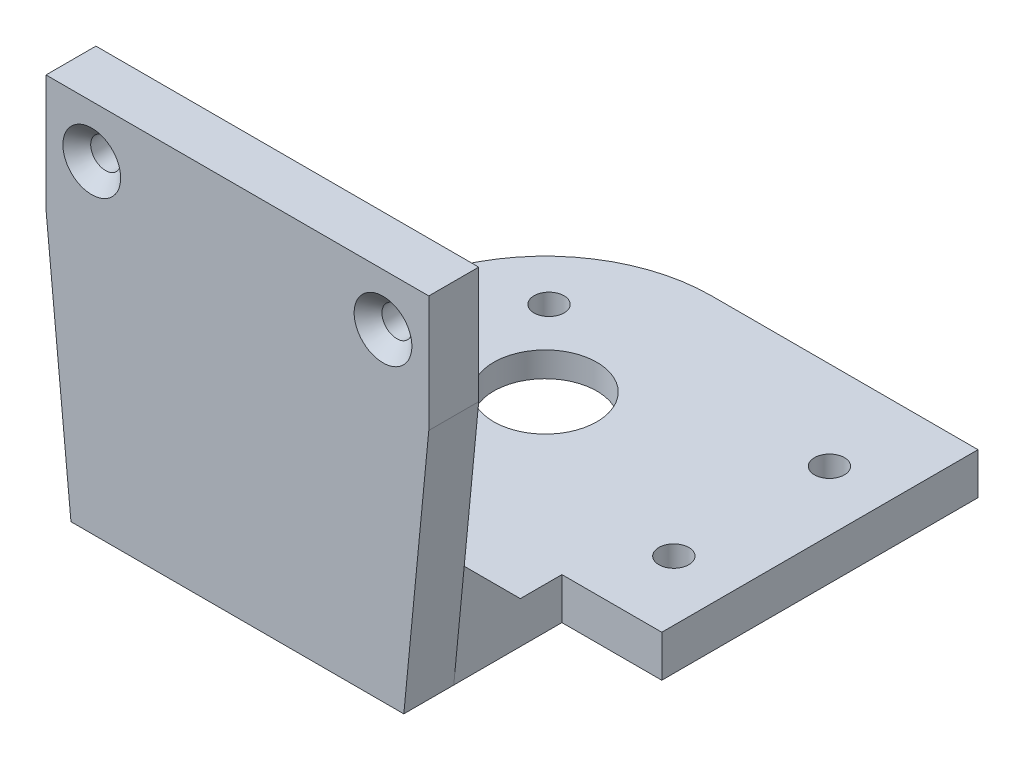
ISO-10303-21;
HEADER;
FILE_DESCRIPTION(('STEP AP214'),'2;1');
FILE_NAME('part.step','',(''),(''),'','','');
FILE_SCHEMA(('AUTOMOTIVE_DESIGN { 1 0 10303 214 1 1 1 1 }'));
ENDSEC;
DATA;
#1=APPLICATION_CONTEXT('core data for automotive mechanical design processes');
#2=APPLICATION_PROTOCOL_DEFINITION('international standard','automotive_design',2000,#1);
#3=PRODUCT_CONTEXT('',#1,'mechanical');
#4=PRODUCT('Part','Part','',(#3));
#5=PRODUCT_RELATED_PRODUCT_CATEGORY('part','',(#4));
#6=PRODUCT_DEFINITION_FORMATION('','',#4);
#7=PRODUCT_DEFINITION_CONTEXT('part definition',#1,'design');
#8=PRODUCT_DEFINITION('design','',#6,#7);
#9=PRODUCT_DEFINITION_SHAPE('','',#8);
#10=(LENGTH_UNIT() NAMED_UNIT(*) SI_UNIT(.MILLI.,.METRE.));
#11=(NAMED_UNIT(*) PLANE_ANGLE_UNIT() SI_UNIT($,.RADIAN.));
#12=(NAMED_UNIT(*) SI_UNIT($,.STERADIAN.) SOLID_ANGLE_UNIT());
#13=UNCERTAINTY_MEASURE_WITH_UNIT(LENGTH_MEASURE(1.E-05),#10,'distance_accuracy_value','');
#14=(GEOMETRIC_REPRESENTATION_CONTEXT(3) GLOBAL_UNCERTAINTY_ASSIGNED_CONTEXT((#13)) GLOBAL_UNIT_ASSIGNED_CONTEXT((#10,
#11,#12)) REPRESENTATION_CONTEXT('',''));
#15=CARTESIAN_POINT('',(0.,0.,0.));
#16=DIRECTION('',(0.,0.,1.));
#17=DIRECTION('',(1.,0.,0.));
#18=AXIS2_PLACEMENT_3D('',#15,#16,#17);
#19=CARTESIAN_POINT('',(0.,-2.,0.));
#20=DIRECTION('',(0.,1.,0.));
#21=DIRECTION('',(0.,0.,1.));
#22=AXIS2_PLACEMENT_3D('',#19,#20,#21);
#23=PLANE('',#22);
#24=CARTESIAN_POINT('',(24.7999999999998,-2.,9.35));
#25=DIRECTION('',(0.,-1.,0.));
#26=DIRECTION('',(0.,0.,-1.));
#27=AXIS2_PLACEMENT_3D('',#24,#25,#26);
#28=CIRCLE('',#27,4.25);
#29=CARTESIAN_POINT('',(24.7999999999998,-2.,5.1));
#30=VERTEX_POINT('',#29);
#31=EDGE_CURVE('E289',#30,#30,#28,.T.);
#32=ORIENTED_EDGE('',*,*,#31,.F.);
#33=EDGE_LOOP('',(#32));
#34=FACE_BOUND('',#33,.T.);
#35=CARTESIAN_POINT('',(24.7999999999998,-2.,-9.35));
#36=DIRECTION('',(0.,-1.,0.));
#37=DIRECTION('',(0.,0.,-1.));
#38=AXIS2_PLACEMENT_3D('',#35,#36,#37);
#39=CIRCLE('',#38,4.25);
#40=CARTESIAN_POINT('',(24.7999999999998,-2.,-13.6));
#41=VERTEX_POINT('',#40);
#42=EDGE_CURVE('E297',#41,#41,#39,.T.);
#43=ORIENTED_EDGE('',*,*,#42,.F.);
#44=EDGE_LOOP('',(#43));
#45=FACE_BOUND('',#44,.T.);
#46=CARTESIAN_POINT('',(0.,-2.,0.));
#47=DIRECTION('',(0.,1.,0.));
#48=DIRECTION('',(0.,0.,1.));
#49=AXIS2_PLACEMENT_3D('',#46,#47,#48);
#50=CIRCLE('',#49,20.);
#51=CARTESIAN_POINT('',(0.,-2.,-20.));
#52=VERTEX_POINT('',#51);
#53=CARTESIAN_POINT('',(-20.,-2.,0.));
#54=VERTEX_POINT('',#53);
#55=EDGE_CURVE('E247',#52,#54,#50,.T.);
#56=ORIENTED_EDGE('',*,*,#55,.F.);
#57=DIRECTION('',(1.,0.,0.));
#58=VECTOR('',#57,1.);
#59=CARTESIAN_POINT('',(0.,-2.,-20.));
#60=LINE('',#59,#58);
#61=CARTESIAN_POINT('',(32.,-2.,-20.));
#62=VERTEX_POINT('',#61);
#63=EDGE_CURVE('E159',#52,#62,#60,.T.);
#64=ORIENTED_EDGE('',*,*,#63,.T.);
#65=DIRECTION('',(0.,0.,1.));
#66=VECTOR('',#65,1.);
#67=CARTESIAN_POINT('',(32.,-2.,-20.));
#68=LINE('',#67,#66);
#69=CARTESIAN_POINT('',(32.,-2.,18.));
#70=VERTEX_POINT('',#69);
#71=EDGE_CURVE('E147',#62,#70,#68,.T.);
#72=ORIENTED_EDGE('',*,*,#71,.T.);
#73=DIRECTION('',(-1.,0.,0.));
#74=VECTOR('',#73,1.);
#75=CARTESIAN_POINT('',(32.,-2.,18.));
#76=LINE('',#75,#74);
#77=CARTESIAN_POINT('',(20.,-2.,18.));
#78=VERTEX_POINT('',#77);
#79=EDGE_CURVE('E153',#70,#78,#76,.T.);
#80=ORIENTED_EDGE('',*,*,#79,.T.);
#81=DIRECTION('',(0.,0.,1.));
#82=VECTOR('',#81,1.);
#83=CARTESIAN_POINT('',(20.,-2.,31.));
#84=LINE('',#83,#82);
#85=CARTESIAN_POINT('',(20.,-2.,31.));
#86=VERTEX_POINT('',#85);
#87=EDGE_CURVE('E232',#78,#86,#84,.T.);
#88=ORIENTED_EDGE('',*,*,#87,.T.);
#89=DIRECTION('',(0.,0.,1.));
#90=VECTOR('',#89,1.);
#91=CARTESIAN_POINT('',(20.,-2.,-0.144823004794875));
#92=LINE('',#91,#90);
#93=CARTESIAN_POINT('',(20.,-2.,37.));
#94=VERTEX_POINT('',#93);
#95=EDGE_CURVE('E190',#86,#94,#92,.T.);
#96=ORIENTED_EDGE('',*,*,#95,.T.);
#97=DIRECTION('',(1.,0.,0.));
#98=VECTOR('',#97,1.);
#99=CARTESIAN_POINT('',(-20.,-2.,37.));
#100=LINE('',#99,#98);
#101=CARTESIAN_POINT('',(-20.,-2.,37.));
#102=VERTEX_POINT('',#101);
#103=EDGE_CURVE('E225',#102,#94,#100,.T.);
#104=ORIENTED_EDGE('',*,*,#103,.F.);
#105=DIRECTION('',(0.,0.,-1.));
#106=VECTOR('',#105,1.);
#107=CARTESIAN_POINT('',(-20.,-2.,0.));
#108=LINE('',#107,#106);
#109=CARTESIAN_POINT('',(-20.,-2.,31.));
#110=VERTEX_POINT('',#109);
#111=EDGE_CURVE('E241',#102,#110,#108,.T.);
#112=ORIENTED_EDGE('',*,*,#111,.T.);
#113=EDGE_CURVE('E234',#110,#54,#108,.T.);
#114=ORIENTED_EDGE('',*,*,#113,.T.);
#115=EDGE_LOOP('',(#56,#64,#72,#80,#88,#96,#104,#112,#114));
#116=FACE_BOUND('',#115,.T.);
#117=CARTESIAN_POINT('',(0.,-2.,0.));
#118=DIRECTION('',(0.,1.,0.));
#119=DIRECTION('',(0.,0.,1.));
#120=AXIS2_PLACEMENT_3D('',#117,#118,#119);
#121=CIRCLE('',#120,18.);
#122=CARTESIAN_POINT('',(0.,-2.,18.));
#123=VERTEX_POINT('',#122);
#124=EDGE_CURVE('E244',#123,#123,#121,.T.);
#125=ORIENTED_EDGE('',*,*,#124,.T.);
#126=EDGE_LOOP('',(#125));
#127=FACE_BOUND('',#126,.T.);
#128=ADVANCED_FACE('F35',(#34,#45,#116,#127),#23,.F.);
#129=CARTESIAN_POINT('',(0.,-2.,0.));
#130=DIRECTION('',(0.,1.,0.));
#131=DIRECTION('',(0.,0.,1.));
#132=AXIS2_PLACEMENT_3D('',#129,#130,#131);
#133=CYLINDRICAL_SURFACE('',#132,20.);
#134=CARTESIAN_POINT('',(0.,3.,0.));
#135=DIRECTION('',(0.,1.,0.));
#136=DIRECTION('',(0.,0.,1.));
#137=AXIS2_PLACEMENT_3D('',#134,#135,#136);
#138=CIRCLE('',#137,20.);
#139=CARTESIAN_POINT('',(0.,3.,-20.));
#140=VERTEX_POINT('',#139);
#141=CARTESIAN_POINT('',(-20.,3.,0.));
#142=VERTEX_POINT('',#141);
#143=EDGE_CURVE('E53',#140,#142,#138,.T.);
#144=ORIENTED_EDGE('',*,*,#143,.F.);
#145=DIRECTION('',(0.,-1.,0.));
#146=VECTOR('',#145,1.);
#147=CARTESIAN_POINT('',(0.,52.6789693934969,-20.));
#148=LINE('',#147,#146);
#149=EDGE_CURVE('E58',#140,#52,#148,.T.);
#150=ORIENTED_EDGE('',*,*,#149,.T.);
#151=ORIENTED_EDGE('',*,*,#55,.T.);
#152=DIRECTION('',(0.,1.,0.));
#153=VECTOR('',#152,1.);
#154=CARTESIAN_POINT('',(-20.,-52.60632371552,0.));
#155=LINE('',#154,#153);
#156=EDGE_CURVE('E235',#54,#142,#155,.T.);
#157=ORIENTED_EDGE('',*,*,#156,.T.);
#158=EDGE_LOOP('',(#144,#150,#151,#157));
#159=FACE_BOUND('',#158,.T.);
#160=ADVANCED_FACE('F312',(#159),#133,.T.);
#161=CARTESIAN_POINT('',(0.,3.,0.));
#162=DIRECTION('',(0.,1.,0.));
#163=DIRECTION('',(0.,0.,1.));
#164=AXIS2_PLACEMENT_3D('',#161,#162,#163);
#165=PLANE('',#164);
#166=CARTESIAN_POINT('',(24.7999999999998,3.,-9.35));
#167=DIRECTION('',(0.,1.,0.));
#168=DIRECTION('',(0.,0.,1.));
#169=AXIS2_PLACEMENT_3D('',#166,#167,#168);
#170=CIRCLE('',#169,1.79999999999999);
#171=CARTESIAN_POINT('',(24.7999999999998,3.,-7.55000000000001));
#172=VERTEX_POINT('',#171);
#173=EDGE_CURVE('E281',#172,#172,#170,.T.);
#174=ORIENTED_EDGE('',*,*,#173,.F.);
#175=EDGE_LOOP('',(#174));
#176=FACE_BOUND('',#175,.T.);
#177=CARTESIAN_POINT('',(-8.90000000000018,3.,-9.35));
#178=DIRECTION('',(0.,1.,0.));
#179=DIRECTION('',(0.,0.,1.));
#180=AXIS2_PLACEMENT_3D('',#177,#178,#179);
#181=CIRCLE('',#180,1.79999999999999);
#182=CARTESIAN_POINT('',(-8.90000000000018,3.,-7.55000000000001));
#183=VERTEX_POINT('',#182);
#184=EDGE_CURVE('E279',#183,#183,#181,.T.);
#185=ORIENTED_EDGE('',*,*,#184,.F.);
#186=EDGE_LOOP('',(#185));
#187=FACE_BOUND('',#186,.T.);
#188=CARTESIAN_POINT('',(-8.90000000000019,3.,9.35));
#189=DIRECTION('',(0.,1.,0.));
#190=DIRECTION('',(0.,0.,1.));
#191=AXIS2_PLACEMENT_3D('',#188,#189,#190);
#192=CIRCLE('',#191,1.79999999999999);
#193=CARTESIAN_POINT('',(-8.90000000000019,3.,11.15));
#194=VERTEX_POINT('',#193);
#195=EDGE_CURVE('E275',#194,#194,#192,.T.);
#196=ORIENTED_EDGE('',*,*,#195,.F.);
#197=EDGE_LOOP('',(#196));
#198=FACE_BOUND('',#197,.T.);
#199=CARTESIAN_POINT('',(24.7999999999998,3.,9.35));
#200=DIRECTION('',(0.,1.,0.));
#201=DIRECTION('',(0.,0.,1.));
#202=AXIS2_PLACEMENT_3D('',#199,#200,#201);
#203=CIRCLE('',#202,1.79999999999999);
#204=CARTESIAN_POINT('',(24.7999999999998,3.,11.15));
#205=VERTEX_POINT('',#204);
#206=EDGE_CURVE('E271',#205,#205,#203,.T.);
#207=ORIENTED_EDGE('',*,*,#206,.F.);
#208=EDGE_LOOP('',(#207));
#209=FACE_BOUND('',#208,.T.);
#210=DIRECTION('',(1.,0.,0.));
#211=VECTOR('',#210,1.);
#212=CARTESIAN_POINT('',(0.,3.,-20.));
#213=LINE('',#212,#211);
#214=CARTESIAN_POINT('',(32.,3.,-20.));
#215=VERTEX_POINT('',#214);
#216=EDGE_CURVE('E135',#140,#215,#213,.T.);
#217=ORIENTED_EDGE('',*,*,#216,.F.);
#218=ORIENTED_EDGE('',*,*,#143,.T.);
#219=DIRECTION('',(0.,0.,1.));
#220=VECTOR('',#219,1.);
#221=CARTESIAN_POINT('',(-20.,3.,0.));
#222=LINE('',#221,#220);
#223=CARTESIAN_POINT('',(-20.,3.,22.9999999999999));
#224=VERTEX_POINT('',#223);
#225=EDGE_CURVE('E230',#142,#224,#222,.T.);
#226=ORIENTED_EDGE('',*,*,#225,.T.);
#227=DIRECTION('',(1.,0.,0.));
#228=VECTOR('',#227,1.);
#229=CARTESIAN_POINT('',(20.,3.,22.9999999999999));
#230=LINE('',#229,#228);
#231=CARTESIAN_POINT('',(20.,3.,22.9999999999999));
#232=VERTEX_POINT('',#231);
#233=EDGE_CURVE('E259',#224,#232,#230,.T.);
#234=ORIENTED_EDGE('',*,*,#233,.T.);
#235=DIRECTION('',(0.,0.,-1.));
#236=VECTOR('',#235,1.);
#237=CARTESIAN_POINT('',(20.,3.,31.));
#238=LINE('',#237,#236);
#239=CARTESIAN_POINT('',(20.,3.,18.));
#240=VERTEX_POINT('',#239);
#241=EDGE_CURVE('E238',#232,#240,#238,.T.);
#242=ORIENTED_EDGE('',*,*,#241,.T.);
#243=DIRECTION('',(-1.,0.,0.));
#244=VECTOR('',#243,1.);
#245=CARTESIAN_POINT('',(32.,3.,18.));
#246=LINE('',#245,#244);
#247=CARTESIAN_POINT('',(32.,3.,18.));
#248=VERTEX_POINT('',#247);
#249=EDGE_CURVE('E138',#248,#240,#246,.T.);
#250=ORIENTED_EDGE('',*,*,#249,.F.);
#251=DIRECTION('',(0.,0.,1.));
#252=VECTOR('',#251,1.);
#253=CARTESIAN_POINT('',(32.,3.,-20.));
#254=LINE('',#253,#252);
#255=EDGE_CURVE('E130',#215,#248,#254,.T.);
#256=ORIENTED_EDGE('',*,*,#255,.F.);
#257=EDGE_LOOP('',(#217,#218,#226,#234,#242,#250,#256));
#258=FACE_BOUND('',#257,.T.);
#259=CARTESIAN_POINT('',(0.,3.,0.));
#260=DIRECTION('',(0.,1.,0.));
#261=DIRECTION('',(0.,0.,1.));
#262=AXIS2_PLACEMENT_3D('',#259,#260,#261);
#263=CIRCLE('',#262,6.2);
#264=CARTESIAN_POINT('',(0.,3.,6.2));
#265=VERTEX_POINT('',#264);
#266=EDGE_CURVE('E251',#265,#265,#263,.T.);
#267=ORIENTED_EDGE('',*,*,#266,.F.);
#268=EDGE_LOOP('',(#267));
#269=FACE_BOUND('',#268,.T.);
#270=ADVANCED_FACE('F132',(#176,#187,#198,#209,#258,#269),#165,.T.);
#271=CARTESIAN_POINT('',(0.,0.,0.));
#272=DIRECTION('',(0.,1.,0.));
#273=DIRECTION('',(0.,0.,1.));
#274=AXIS2_PLACEMENT_3D('',#271,#272,#273);
#275=PLANE('',#274);
#276=CARTESIAN_POINT('',(-8.90000000000018,0.,-9.35));
#277=DIRECTION('',(0.,1.,0.));
#278=DIRECTION('',(0.,0.,1.));
#279=AXIS2_PLACEMENT_3D('',#276,#277,#278);
#280=CIRCLE('',#279,1.79999999999999);
#281=CARTESIAN_POINT('',(-8.90000000000018,0.,-7.55000000000001));
#282=VERTEX_POINT('',#281);
#283=EDGE_CURVE('E278',#282,#282,#280,.T.);
#284=ORIENTED_EDGE('',*,*,#283,.T.);
#285=EDGE_LOOP('',(#284));
#286=FACE_BOUND('',#285,.T.);
#287=CARTESIAN_POINT('',(-8.90000000000019,0.,9.35));
#288=DIRECTION('',(0.,1.,0.));
#289=DIRECTION('',(0.,0.,1.));
#290=AXIS2_PLACEMENT_3D('',#287,#288,#289);
#291=CIRCLE('',#290,1.79999999999999);
#292=CARTESIAN_POINT('',(-8.90000000000019,0.,11.15));
#293=VERTEX_POINT('',#292);
#294=EDGE_CURVE('E274',#293,#293,#291,.T.);
#295=ORIENTED_EDGE('',*,*,#294,.T.);
#296=EDGE_LOOP('',(#295));
#297=FACE_BOUND('',#296,.T.);
#298=CARTESIAN_POINT('',(0.,0.,0.));
#299=DIRECTION('',(0.,1.,0.));
#300=DIRECTION('',(0.,0.,1.));
#301=AXIS2_PLACEMENT_3D('',#298,#299,#300);
#302=CIRCLE('',#301,18.);
#303=CARTESIAN_POINT('',(0.,0.,18.));
#304=VERTEX_POINT('',#303);
#305=EDGE_CURVE('E254',#304,#304,#302,.T.);
#306=ORIENTED_EDGE('',*,*,#305,.F.);
#307=EDGE_LOOP('',(#306));
#308=FACE_BOUND('',#307,.T.);
#309=CARTESIAN_POINT('',(0.,0.,0.));
#310=DIRECTION('',(0.,1.,0.));
#311=DIRECTION('',(0.,0.,1.));
#312=AXIS2_PLACEMENT_3D('',#309,#310,#311);
#313=CIRCLE('',#312,6.2);
#314=CARTESIAN_POINT('',(0.,0.,6.2));
#315=VERTEX_POINT('',#314);
#316=EDGE_CURVE('E249',#315,#315,#313,.T.);
#317=ORIENTED_EDGE('',*,*,#316,.T.);
#318=EDGE_LOOP('',(#317));
#319=FACE_BOUND('',#318,.T.);
#320=ADVANCED_FACE('F377',(#286,#297,#308,#319),#275,.F.);
#321=CARTESIAN_POINT('',(0.,3.,0.));
#322=DIRECTION('',(0.,-1.,0.));
#323=DIRECTION('',(0.,0.,-1.));
#324=AXIS2_PLACEMENT_3D('',#321,#322,#323);
#325=CYLINDRICAL_SURFACE('',#324,6.2);
#326=ORIENTED_EDGE('',*,*,#266,.T.);
#327=EDGE_LOOP('',(#326));
#328=FACE_BOUND('',#327,.T.);
#329=ORIENTED_EDGE('',*,*,#316,.F.);
#330=EDGE_LOOP('',(#329));
#331=FACE_BOUND('',#330,.T.);
#332=ADVANCED_FACE('F374',(#328,#331),#325,.F.);
#333=CARTESIAN_POINT('',(0.,-2.,0.));
#334=DIRECTION('',(0.,1.,0.));
#335=DIRECTION('',(0.,0.,1.));
#336=AXIS2_PLACEMENT_3D('',#333,#334,#335);
#337=CYLINDRICAL_SURFACE('',#336,18.);
#338=ORIENTED_EDGE('',*,*,#124,.F.);
#339=EDGE_LOOP('',(#338));
#340=FACE_BOUND('',#339,.T.);
#341=ORIENTED_EDGE('',*,*,#305,.T.);
#342=EDGE_LOOP('',(#341));
#343=FACE_BOUND('',#342,.T.);
#344=ADVANCED_FACE('F372',(#340,#343),#337,.F.);
#345=CARTESIAN_POINT('',(20.,-52.60632371552,31.));
#346=DIRECTION('',(1.,0.,0.));
#347=DIRECTION('',(0.,0.,-1.));
#348=AXIS2_PLACEMENT_3D('',#345,#346,#347);
#349=PLANE('',#348);
#350=DIRECTION('',(0.,-1.,0.));
#351=VECTOR('',#350,1.);
#352=CARTESIAN_POINT('',(20.,52.6789693934969,18.));
#353=LINE('',#352,#351);
#354=EDGE_CURVE('E161',#240,#78,#353,.T.);
#355=ORIENTED_EDGE('',*,*,#354,.F.);
#356=ORIENTED_EDGE('',*,*,#241,.F.);
#357=DIRECTION('',(0.,-0.707106781186544,-0.707106781186552));
#358=VECTOR('',#357,1.);
#359=CARTESIAN_POINT('',(20.,3.,22.9999999999999));
#360=LINE('',#359,#358);
#361=CARTESIAN_POINT('',(20.,11.,31.));
#362=VERTEX_POINT('',#361);
#363=EDGE_CURVE('E45',#232,#362,#360,.F.);
#364=ORIENTED_EDGE('',*,*,#363,.T.);
#365=DIRECTION('',(0.,-1.,0.));
#366=VECTOR('',#365,1.);
#367=CARTESIAN_POINT('',(20.,-2.,31.));
#368=LINE('',#367,#366);
#369=EDGE_CURVE('E187',#362,#86,#368,.T.);
#370=ORIENTED_EDGE('',*,*,#369,.T.);
#371=ORIENTED_EDGE('',*,*,#87,.F.);
#372=EDGE_LOOP('',(#355,#356,#364,#370,#371));
#373=FACE_BOUND('',#372,.T.);
#374=ADVANCED_FACE('F322',(#373),#349,.T.);
#375=CARTESIAN_POINT('',(-20.,-52.60632371552,0.));
#376=DIRECTION('',(-1.,0.,0.));
#377=DIRECTION('',(0.,0.,1.));
#378=AXIS2_PLACEMENT_3D('',#375,#376,#377);
#379=PLANE('',#378);
#380=DIRECTION('',(0.,1.,0.));
#381=VECTOR('',#380,1.);
#382=CARTESIAN_POINT('',(-20.,29.,31.));
#383=LINE('',#382,#381);
#384=CARTESIAN_POINT('',(-20.,11.,31.));
#385=VERTEX_POINT('',#384);
#386=EDGE_CURVE('E198',#110,#385,#383,.T.);
#387=ORIENTED_EDGE('',*,*,#386,.T.);
#388=DIRECTION('',(0.,0.707106781186544,0.707106781186552));
#389=VECTOR('',#388,1.);
#390=CARTESIAN_POINT('',(-20.,3.,22.9999999999999));
#391=LINE('',#390,#389);
#392=EDGE_CURVE('E11',#385,#224,#391,.F.);
#393=ORIENTED_EDGE('',*,*,#392,.T.);
#394=ORIENTED_EDGE('',*,*,#225,.F.);
#395=ORIENTED_EDGE('',*,*,#156,.F.);
#396=ORIENTED_EDGE('',*,*,#113,.F.);
#397=EDGE_LOOP('',(#387,#393,#394,#395,#396));
#398=FACE_BOUND('',#397,.T.);
#399=ADVANCED_FACE('F315',(#398),#379,.T.);
#400=CARTESIAN_POINT('',(0.,0.,31.));
#401=DIRECTION('',(0.,0.,-1.));
#402=DIRECTION('',(-1.,0.,0.));
#403=AXIS2_PLACEMENT_3D('',#400,#401,#402);
#404=PLANE('',#403);
#405=CARTESIAN_POINT('',(17.4999999999999,36.7528144712617,31.));
#406=DIRECTION('',(0.,0.,-1.));
#407=DIRECTION('',(-1.,0.,0.));
#408=AXIS2_PLACEMENT_3D('',#405,#406,#407);
#409=CIRCLE('',#408,1.79999999999999);
#410=CARTESIAN_POINT('',(15.6999999999999,36.7528144712617,31.));
#411=VERTEX_POINT('',#410);
#412=EDGE_CURVE('E173',#411,#411,#409,.T.);
#413=ORIENTED_EDGE('',*,*,#412,.F.);
#414=EDGE_LOOP('',(#413));
#415=FACE_BOUND('',#414,.T.);
#416=CARTESIAN_POINT('',(-17.5000000000001,36.7528144712617,31.));
#417=DIRECTION('',(0.,0.,-1.));
#418=DIRECTION('',(-1.,0.,0.));
#419=AXIS2_PLACEMENT_3D('',#416,#417,#418);
#420=CIRCLE('',#419,1.79999999999999);
#421=CARTESIAN_POINT('',(-19.3000000000001,36.7528144712617,31.));
#422=VERTEX_POINT('',#421);
#423=EDGE_CURVE('E180',#422,#422,#420,.T.);
#424=ORIENTED_EDGE('',*,*,#423,.F.);
#425=EDGE_LOOP('',(#424));
#426=FACE_BOUND('',#425,.T.);
#427=ORIENTED_EDGE('',*,*,#369,.F.);
#428=DIRECTION('',(-1.,0.,0.));
#429=VECTOR('',#428,1.);
#430=CARTESIAN_POINT('',(-20.,11.,31.));
#431=LINE('',#430,#429);
#432=EDGE_CURVE('E262',#362,#385,#431,.T.);
#433=ORIENTED_EDGE('',*,*,#432,.T.);
#434=ORIENTED_EDGE('',*,*,#386,.F.);
#435=DIRECTION('',(0.0963241948601904,-0.9953500135553,0.));
#436=VECTOR('',#435,1.);
#437=CARTESIAN_POINT('',(-23.,29.,31.));
#438=LINE('',#437,#436);
#439=CARTESIAN_POINT('',(-23.,29.,31.));
#440=VERTEX_POINT('',#439);
#441=EDGE_CURVE('E195',#440,#110,#438,.T.);
#442=ORIENTED_EDGE('',*,*,#441,.F.);
#443=DIRECTION('',(0.,-1.,0.));
#444=VECTOR('',#443,1.);
#445=CARTESIAN_POINT('',(-23.,43.,31.));
#446=LINE('',#445,#444);
#447=CARTESIAN_POINT('',(-23.,43.,31.));
#448=VERTEX_POINT('',#447);
#449=EDGE_CURVE('E207',#448,#440,#446,.T.);
#450=ORIENTED_EDGE('',*,*,#449,.F.);
#451=DIRECTION('',(-1.,0.,0.));
#452=VECTOR('',#451,1.);
#453=CARTESIAN_POINT('',(-20.,43.,31.));
#454=LINE('',#453,#452);
#455=CARTESIAN_POINT('',(23.,43.,31.));
#456=VERTEX_POINT('',#455);
#457=EDGE_CURVE('E224',#456,#448,#454,.T.);
#458=ORIENTED_EDGE('',*,*,#457,.F.);
#459=DIRECTION('',(0.,1.,0.));
#460=VECTOR('',#459,1.);
#461=CARTESIAN_POINT('',(23.,43.,31.));
#462=LINE('',#461,#460);
#463=CARTESIAN_POINT('',(23.,29.,31.));
#464=VERTEX_POINT('',#463);
#465=EDGE_CURVE('E212',#464,#456,#462,.T.);
#466=ORIENTED_EDGE('',*,*,#465,.F.);
#467=DIRECTION('',(0.0963241948601904,0.9953500135553,0.));
#468=VECTOR('',#467,1.);
#469=CARTESIAN_POINT('',(20.,-2.,31.));
#470=LINE('',#469,#468);
#471=EDGE_CURVE('E184',#86,#464,#470,.T.);
#472=ORIENTED_EDGE('',*,*,#471,.F.);
#473=EDGE_LOOP('',(#427,#433,#434,#442,#450,#458,#466,#472));
#474=FACE_BOUND('',#473,.T.);
#475=ADVANCED_FACE('F349',(#415,#426,#474),#404,.T.);
#476=CARTESIAN_POINT('',(-20.,43.,37.));
#477=DIRECTION('',(0.,-1.,0.));
#478=DIRECTION('',(0.,0.,-1.));
#479=AXIS2_PLACEMENT_3D('',#476,#477,#478);
#480=PLANE('',#479);
#481=ORIENTED_EDGE('',*,*,#457,.T.);
#482=DIRECTION('',(0.,0.,1.));
#483=VECTOR('',#482,1.);
#484=CARTESIAN_POINT('',(-23.,43.,-17.0832611206852));
#485=LINE('',#484,#483);
#486=CARTESIAN_POINT('',(-23.,43.,37.));
#487=VERTEX_POINT('',#486);
#488=EDGE_CURVE('E211',#448,#487,#485,.T.);
#489=ORIENTED_EDGE('',*,*,#488,.T.);
#490=DIRECTION('',(-1.,0.,0.));
#491=VECTOR('',#490,1.);
#492=CARTESIAN_POINT('',(-20.,43.,37.));
#493=LINE('',#492,#491);
#494=CARTESIAN_POINT('',(23.,43.,37.));
#495=VERTEX_POINT('',#494);
#496=EDGE_CURVE('E228',#495,#487,#493,.T.);
#497=ORIENTED_EDGE('',*,*,#496,.F.);
#498=DIRECTION('',(0.,0.,1.));
#499=VECTOR('',#498,1.);
#500=CARTESIAN_POINT('',(23.,43.,-17.0832611206852));
#501=LINE('',#500,#499);
#502=EDGE_CURVE('E215',#456,#495,#501,.T.);
#503=ORIENTED_EDGE('',*,*,#502,.F.);
#504=EDGE_LOOP('',(#481,#489,#497,#503));
#505=FACE_BOUND('',#504,.T.);
#506=ADVANCED_FACE('F341',(#505),#480,.F.);
#507=CARTESIAN_POINT('',(0.,0.,37.));
#508=DIRECTION('',(0.,0.,-1.));
#509=DIRECTION('',(-1.,0.,0.));
#510=AXIS2_PLACEMENT_3D('',#507,#508,#509);
#511=PLANE('',#510);
#512=CARTESIAN_POINT('',(17.4999999999999,36.7528144712617,37.));
#513=DIRECTION('',(0.,0.,1.));
#514=DIRECTION('',(1.,0.,0.));
#515=AXIS2_PLACEMENT_3D('',#512,#513,#514);
#516=CIRCLE('',#515,3.47);
#517=CARTESIAN_POINT('',(20.9699999999999,36.7528144712617,37.));
#518=VERTEX_POINT('',#517);
#519=EDGE_CURVE('E167',#518,#518,#516,.T.);
#520=ORIENTED_EDGE('',*,*,#519,.F.);
#521=EDGE_LOOP('',(#520));
#522=FACE_BOUND('',#521,.T.);
#523=CARTESIAN_POINT('',(-17.5000000000001,36.7528144712617,37.));
#524=DIRECTION('',(0.,0.,1.));
#525=DIRECTION('',(1.,0.,0.));
#526=AXIS2_PLACEMENT_3D('',#523,#524,#525);
#527=CIRCLE('',#526,3.47);
#528=CARTESIAN_POINT('',(-14.0300000000001,36.7528144712617,37.));
#529=VERTEX_POINT('',#528);
#530=EDGE_CURVE('E174',#529,#529,#527,.T.);
#531=ORIENTED_EDGE('',*,*,#530,.F.);
#532=EDGE_LOOP('',(#531));
#533=FACE_BOUND('',#532,.T.);
#534=DIRECTION('',(0.0963241948601904,-0.9953500135553,0.));
#535=VECTOR('',#534,1.);
#536=CARTESIAN_POINT('',(-23.,29.,37.));
#537=LINE('',#536,#535);
#538=CARTESIAN_POINT('',(-23.,29.,37.));
#539=VERTEX_POINT('',#538);
#540=EDGE_CURVE('E192',#539,#102,#537,.T.);
#541=ORIENTED_EDGE('',*,*,#540,.T.);
#542=ORIENTED_EDGE('',*,*,#103,.T.);
#543=DIRECTION('',(0.0963241948601904,0.9953500135553,0.));
#544=VECTOR('',#543,1.);
#545=CARTESIAN_POINT('',(20.,-2.,37.));
#546=LINE('',#545,#544);
#547=CARTESIAN_POINT('',(23.,29.,37.));
#548=VERTEX_POINT('',#547);
#549=EDGE_CURVE('E181',#94,#548,#546,.T.);
#550=ORIENTED_EDGE('',*,*,#549,.T.);
#551=DIRECTION('',(0.,1.,0.));
#552=VECTOR('',#551,1.);
#553=CARTESIAN_POINT('',(23.,43.,37.));
#554=LINE('',#553,#552);
#555=EDGE_CURVE('E201',#548,#495,#554,.T.);
#556=ORIENTED_EDGE('',*,*,#555,.T.);
#557=ORIENTED_EDGE('',*,*,#496,.T.);
#558=DIRECTION('',(0.,-1.,0.));
#559=VECTOR('',#558,1.);
#560=CARTESIAN_POINT('',(-23.,43.,37.));
#561=LINE('',#560,#559);
#562=EDGE_CURVE('E200',#487,#539,#561,.T.);
#563=ORIENTED_EDGE('',*,*,#562,.T.);
#564=EDGE_LOOP('',(#541,#542,#550,#556,#557,#563));
#565=FACE_BOUND('',#564,.T.);
#566=ADVANCED_FACE('F332',(#522,#533,#565),#511,.F.);
#567=CARTESIAN_POINT('',(-23.,43.,-17.0832611206852));
#568=DIRECTION('',(-1.,0.,0.));
#569=DIRECTION('',(0.,-1.,0.));
#570=AXIS2_PLACEMENT_3D('',#567,#568,#569);
#571=PLANE('',#570);
#572=ORIENTED_EDGE('',*,*,#488,.F.);
#573=ORIENTED_EDGE('',*,*,#449,.T.);
#574=DIRECTION('',(0.,0.,1.));
#575=VECTOR('',#574,1.);
#576=CARTESIAN_POINT('',(-23.,29.,-17.0832611206852));
#577=LINE('',#576,#575);
#578=EDGE_CURVE('E210',#440,#539,#577,.T.);
#579=ORIENTED_EDGE('',*,*,#578,.T.);
#580=ORIENTED_EDGE('',*,*,#562,.F.);
#581=EDGE_LOOP('',(#572,#573,#579,#580));
#582=FACE_BOUND('',#581,.T.);
#583=ADVANCED_FACE('F344',(#582),#571,.T.);
#584=CARTESIAN_POINT('',(23.,43.,-17.0832611206852));
#585=DIRECTION('',(1.,0.,0.));
#586=DIRECTION('',(0.,1.,0.));
#587=AXIS2_PLACEMENT_3D('',#584,#585,#586);
#588=PLANE('',#587);
#589=DIRECTION('',(0.,0.,1.));
#590=VECTOR('',#589,1.);
#591=CARTESIAN_POINT('',(23.,29.,-17.0832611206852));
#592=LINE('',#591,#590);
#593=EDGE_CURVE('E204',#464,#548,#592,.T.);
#594=ORIENTED_EDGE('',*,*,#593,.F.);
#595=ORIENTED_EDGE('',*,*,#465,.T.);
#596=ORIENTED_EDGE('',*,*,#502,.T.);
#597=ORIENTED_EDGE('',*,*,#555,.F.);
#598=EDGE_LOOP('',(#594,#595,#596,#597));
#599=FACE_BOUND('',#598,.T.);
#600=ADVANCED_FACE('F336',(#599),#588,.T.);
#601=CARTESIAN_POINT('',(-23.,29.,-0.144823004794875));
#602=DIRECTION('',(-0.9953500135553,-0.0963241948601904,0.));
#603=DIRECTION('',(0.0963241948601904,-0.9953500135553,0.));
#604=AXIS2_PLACEMENT_3D('',#601,#602,#603);
#605=PLANE('',#604);
#606=ORIENTED_EDGE('',*,*,#578,.F.);
#607=ORIENTED_EDGE('',*,*,#441,.T.);
#608=ORIENTED_EDGE('',*,*,#111,.F.);
#609=ORIENTED_EDGE('',*,*,#540,.F.);
#610=EDGE_LOOP('',(#606,#607,#608,#609));
#611=FACE_BOUND('',#610,.T.);
#612=ADVANCED_FACE('F347',(#611),#605,.T.);
#613=CARTESIAN_POINT('',(20.,-2.,-0.144823004794875));
#614=DIRECTION('',(0.9953500135553,-0.0963241948601904,0.));
#615=DIRECTION('',(0.0963241948601904,0.9953500135553,0.));
#616=AXIS2_PLACEMENT_3D('',#613,#614,#615);
#617=PLANE('',#616);
#618=ORIENTED_EDGE('',*,*,#95,.F.);
#619=ORIENTED_EDGE('',*,*,#471,.T.);
#620=ORIENTED_EDGE('',*,*,#593,.T.);
#621=ORIENTED_EDGE('',*,*,#549,.F.);
#622=EDGE_LOOP('',(#618,#619,#620,#621));
#623=FACE_BOUND('',#622,.T.);
#624=ADVANCED_FACE('F333',(#623),#617,.T.);
#625=CARTESIAN_POINT('',(0.,3.,22.9999999999999));
#626=DIRECTION('',(0.,0.707106781186551,-0.707106781186543));
#627=DIRECTION('',(-1.,0.,0.));
#628=AXIS2_PLACEMENT_3D('',#625,#626,#627);
#629=PLANE('',#628);
#630=ORIENTED_EDGE('',*,*,#392,.F.);
#631=ORIENTED_EDGE('',*,*,#432,.F.);
#632=ORIENTED_EDGE('',*,*,#363,.F.);
#633=ORIENTED_EDGE('',*,*,#233,.F.);
#634=EDGE_LOOP('',(#630,#631,#632,#633));
#635=FACE_BOUND('',#634,.T.);
#636=ADVANCED_FACE('F38',(#635),#629,.T.);
#637=CARTESIAN_POINT('',(-17.5000000000001,36.7528144712617,37.));
#638=DIRECTION('',(0.,0.,1.));
#639=DIRECTION('',(1.,0.,0.));
#640=AXIS2_PLACEMENT_3D('',#637,#638,#639);
#641=CYLINDRICAL_SURFACE('',#640,1.79999999999999);
#642=ORIENTED_EDGE('',*,*,#423,.T.);
#643=EDGE_LOOP('',(#642));
#644=FACE_BOUND('',#643,.T.);
#645=CARTESIAN_POINT('',(-17.5000000000001,36.7528144712617,35.33));
#646=DIRECTION('',(0.,0.,1.));
#647=DIRECTION('',(1.,0.,0.));
#648=AXIS2_PLACEMENT_3D('',#645,#646,#647);
#649=CIRCLE('',#648,1.79999999999999);
#650=CARTESIAN_POINT('',(-15.7000000000001,36.7528144712617,35.33));
#651=VERTEX_POINT('',#650);
#652=EDGE_CURVE('E177',#651,#651,#649,.T.);
#653=ORIENTED_EDGE('',*,*,#652,.T.);
#654=EDGE_LOOP('',(#653));
#655=FACE_BOUND('',#654,.T.);
#656=ADVANCED_FACE('F424',(#644,#655),#641,.F.);
#657=CARTESIAN_POINT('',(-17.5000000000001,36.7528144712617,37.));
#658=DIRECTION('',(0.,0.,1.));
#659=DIRECTION('',(1.,0.,0.));
#660=AXIS2_PLACEMENT_3D('',#657,#658,#659);
#661=CONICAL_SURFACE('',#660,3.47,0.785398163397451);
#662=ORIENTED_EDGE('',*,*,#652,.F.);
#663=EDGE_LOOP('',(#662));
#664=FACE_BOUND('',#663,.T.);
#665=ORIENTED_EDGE('',*,*,#530,.T.);
#666=EDGE_LOOP('',(#665));
#667=FACE_BOUND('',#666,.T.);
#668=ADVANCED_FACE('F449',(#664,#667),#661,.F.);
#669=CARTESIAN_POINT('',(17.4999999999999,36.7528144712617,37.));
#670=DIRECTION('',(0.,0.,1.));
#671=DIRECTION('',(1.,0.,0.));
#672=AXIS2_PLACEMENT_3D('',#669,#670,#671);
#673=CYLINDRICAL_SURFACE('',#672,1.79999999999999);
#674=ORIENTED_EDGE('',*,*,#412,.T.);
#675=EDGE_LOOP('',(#674));
#676=FACE_BOUND('',#675,.T.);
#677=CARTESIAN_POINT('',(17.4999999999999,36.7528144712617,35.33));
#678=DIRECTION('',(0.,0.,1.));
#679=DIRECTION('',(1.,0.,0.));
#680=AXIS2_PLACEMENT_3D('',#677,#678,#679);
#681=CIRCLE('',#680,1.79999999999999);
#682=CARTESIAN_POINT('',(19.2999999999999,36.7528144712617,35.33));
#683=VERTEX_POINT('',#682);
#684=EDGE_CURVE('E170',#683,#683,#681,.T.);
#685=ORIENTED_EDGE('',*,*,#684,.T.);
#686=EDGE_LOOP('',(#685));
#687=FACE_BOUND('',#686,.T.);
#688=ADVANCED_FACE('F459',(#676,#687),#673,.F.);
#689=CARTESIAN_POINT('',(17.4999999999999,36.7528144712617,37.));
#690=DIRECTION('',(0.,0.,1.));
#691=DIRECTION('',(1.,0.,0.));
#692=AXIS2_PLACEMENT_3D('',#689,#690,#691);
#693=CONICAL_SURFACE('',#692,3.47,0.785398163397451);
#694=ORIENTED_EDGE('',*,*,#684,.F.);
#695=EDGE_LOOP('',(#694));
#696=FACE_BOUND('',#695,.T.);
#697=ORIENTED_EDGE('',*,*,#519,.T.);
#698=EDGE_LOOP('',(#697));
#699=FACE_BOUND('',#698,.T.);
#700=ADVANCED_FACE('F469',(#696,#699),#693,.F.);
#701=CARTESIAN_POINT('',(0.,52.6789693934969,-20.));
#702=DIRECTION('',(0.,0.,-1.));
#703=DIRECTION('',(-1.,0.,0.));
#704=AXIS2_PLACEMENT_3D('',#701,#702,#703);
#705=PLANE('',#704);
#706=ORIENTED_EDGE('',*,*,#149,.F.);
#707=ORIENTED_EDGE('',*,*,#216,.T.);
#708=DIRECTION('',(0.,-1.,0.));
#709=VECTOR('',#708,1.);
#710=CARTESIAN_POINT('',(32.,52.6789693934969,-20.));
#711=LINE('',#710,#709);
#712=EDGE_CURVE('E142',#215,#62,#711,.T.);
#713=ORIENTED_EDGE('',*,*,#712,.T.);
#714=ORIENTED_EDGE('',*,*,#63,.F.);
#715=EDGE_LOOP('',(#706,#707,#713,#714));
#716=FACE_BOUND('',#715,.T.);
#717=ADVANCED_FACE('F152',(#716),#705,.T.);
#718=CARTESIAN_POINT('',(32.,52.6789693934969,-20.));
#719=DIRECTION('',(1.,0.,0.));
#720=DIRECTION('',(0.,0.,-1.));
#721=AXIS2_PLACEMENT_3D('',#718,#719,#720);
#722=PLANE('',#721);
#723=ORIENTED_EDGE('',*,*,#712,.F.);
#724=ORIENTED_EDGE('',*,*,#255,.T.);
#725=DIRECTION('',(0.,-1.,0.));
#726=VECTOR('',#725,1.);
#727=CARTESIAN_POINT('',(32.,52.6789693934969,18.));
#728=LINE('',#727,#726);
#729=EDGE_CURVE('E141',#248,#70,#728,.T.);
#730=ORIENTED_EDGE('',*,*,#729,.T.);
#731=ORIENTED_EDGE('',*,*,#71,.F.);
#732=EDGE_LOOP('',(#723,#724,#730,#731));
#733=FACE_BOUND('',#732,.T.);
#734=ADVANCED_FACE('F145',(#733),#722,.T.);
#735=CARTESIAN_POINT('',(32.,52.6789693934969,18.));
#736=DIRECTION('',(0.,0.,1.));
#737=DIRECTION('',(1.,0.,0.));
#738=AXIS2_PLACEMENT_3D('',#735,#736,#737);
#739=PLANE('',#738);
#740=ORIENTED_EDGE('',*,*,#729,.F.);
#741=ORIENTED_EDGE('',*,*,#249,.T.);
#742=ORIENTED_EDGE('',*,*,#354,.T.);
#743=ORIENTED_EDGE('',*,*,#79,.F.);
#744=EDGE_LOOP('',(#740,#741,#742,#743));
#745=FACE_BOUND('',#744,.T.);
#746=ADVANCED_FACE('F325',(#745),#739,.T.);
#747=CARTESIAN_POINT('',(24.7999999999998,-2.,9.35));
#748=DIRECTION('',(0.,-1.,0.));
#749=DIRECTION('',(0.,0.,-1.));
#750=AXIS2_PLACEMENT_3D('',#747,#748,#749);
#751=CYLINDRICAL_SURFACE('',#750,1.79999999999999);
#752=CARTESIAN_POINT('',(24.7999999999998,0.,9.35));
#753=DIRECTION('',(0.,1.,0.));
#754=DIRECTION('',(0.,0.,1.));
#755=AXIS2_PLACEMENT_3D('',#752,#753,#754);
#756=CIRCLE('',#755,1.79999999999999);
#757=CARTESIAN_POINT('',(24.7999999999998,0.,11.15));
#758=VERTEX_POINT('',#757);
#759=EDGE_CURVE('E40',#758,#758,#756,.F.);
#760=ORIENTED_EDGE('',*,*,#759,.T.);
#761=EDGE_LOOP('',(#760));
#762=FACE_BOUND('',#761,.T.);
#763=ORIENTED_EDGE('',*,*,#206,.T.);
#764=EDGE_LOOP('',(#763));
#765=FACE_BOUND('',#764,.T.);
#766=ADVANCED_FACE('F515',(#762,#765),#751,.F.);
#767=CARTESIAN_POINT('',(-8.90000000000019,-2.,9.35));
#768=DIRECTION('',(0.,-1.,0.));
#769=DIRECTION('',(0.,0.,-1.));
#770=AXIS2_PLACEMENT_3D('',#767,#768,#769);
#771=CYLINDRICAL_SURFACE('',#770,1.79999999999999);
#772=ORIENTED_EDGE('',*,*,#195,.T.);
#773=EDGE_LOOP('',(#772));
#774=FACE_BOUND('',#773,.T.);
#775=ORIENTED_EDGE('',*,*,#294,.F.);
#776=EDGE_LOOP('',(#775));
#777=FACE_BOUND('',#776,.T.);
#778=ADVANCED_FACE('F509',(#774,#777),#771,.F.);
#779=CARTESIAN_POINT('',(-8.90000000000018,-2.,-9.35));
#780=DIRECTION('',(0.,-1.,0.));
#781=DIRECTION('',(0.,0.,-1.));
#782=AXIS2_PLACEMENT_3D('',#779,#780,#781);
#783=CYLINDRICAL_SURFACE('',#782,1.79999999999999);
#784=ORIENTED_EDGE('',*,*,#184,.T.);
#785=EDGE_LOOP('',(#784));
#786=FACE_BOUND('',#785,.T.);
#787=ORIENTED_EDGE('',*,*,#283,.F.);
#788=EDGE_LOOP('',(#787));
#789=FACE_BOUND('',#788,.T.);
#790=ADVANCED_FACE('F514',(#786,#789),#783,.F.);
#791=CARTESIAN_POINT('',(24.7999999999998,-2.,-9.35));
#792=DIRECTION('',(0.,-1.,0.));
#793=DIRECTION('',(0.,0.,-1.));
#794=AXIS2_PLACEMENT_3D('',#791,#792,#793);
#795=CYLINDRICAL_SURFACE('',#794,1.79999999999999);
#796=CARTESIAN_POINT('',(24.7999999999998,0.,-9.35));
#797=DIRECTION('',(0.,1.,0.));
#798=DIRECTION('',(0.,0.,1.));
#799=AXIS2_PLACEMENT_3D('',#796,#797,#798);
#800=CIRCLE('',#799,1.79999999999999);
#801=CARTESIAN_POINT('',(24.7999999999998,0.,-7.55000000000001));
#802=VERTEX_POINT('',#801);
#803=EDGE_CURVE('E282',#802,#802,#800,.F.);
#804=ORIENTED_EDGE('',*,*,#803,.T.);
#805=EDGE_LOOP('',(#804));
#806=FACE_BOUND('',#805,.T.);
#807=ORIENTED_EDGE('',*,*,#173,.T.);
#808=EDGE_LOOP('',(#807));
#809=FACE_BOUND('',#808,.T.);
#810=ADVANCED_FACE('F526',(#806,#809),#795,.F.);
#811=CARTESIAN_POINT('',(0.,0.,0.));
#812=DIRECTION('',(0.,1.,0.));
#813=DIRECTION('',(0.,0.,1.));
#814=AXIS2_PLACEMENT_3D('',#811,#812,#813);
#815=PLANE('',#814);
#816=CARTESIAN_POINT('',(24.7999999999998,0.,-9.35));
#817=DIRECTION('',(0.,1.,0.));
#818=DIRECTION('',(0.,0.,1.));
#819=AXIS2_PLACEMENT_3D('',#816,#817,#818);
#820=CIRCLE('',#819,4.25);
#821=CARTESIAN_POINT('',(24.7999999999998,0.,-5.1));
#822=VERTEX_POINT('',#821);
#823=EDGE_CURVE('E294',#822,#822,#820,.F.);
#824=ORIENTED_EDGE('',*,*,#823,.T.);
#825=EDGE_LOOP('',(#824));
#826=FACE_BOUND('',#825,.T.);
#827=ORIENTED_EDGE('',*,*,#803,.F.);
#828=EDGE_LOOP('',(#827));
#829=FACE_BOUND('',#828,.T.);
#830=ADVANCED_FACE('F549',(#826,#829),#815,.F.);
#831=CARTESIAN_POINT('',(24.7999999999998,12.0208152801713,-9.35));
#832=DIRECTION('',(0.,-1.,0.));
#833=DIRECTION('',(0.,0.,-1.));
#834=AXIS2_PLACEMENT_3D('',#831,#832,#833);
#835=CYLINDRICAL_SURFACE('',#834,4.25);
#836=ORIENTED_EDGE('',*,*,#42,.T.);
#837=EDGE_LOOP('',(#836));
#838=FACE_BOUND('',#837,.T.);
#839=ORIENTED_EDGE('',*,*,#823,.F.);
#840=EDGE_LOOP('',(#839));
#841=FACE_BOUND('',#840,.T.);
#842=ADVANCED_FACE('F558',(#838,#841),#835,.F.);
#843=CARTESIAN_POINT('',(0.,0.,0.));
#844=DIRECTION('',(0.,1.,0.));
#845=DIRECTION('',(0.,0.,1.));
#846=AXIS2_PLACEMENT_3D('',#843,#844,#845);
#847=PLANE('',#846);
#848=CARTESIAN_POINT('',(24.7999999999998,0.,9.35));
#849=DIRECTION('',(0.,1.,0.));
#850=DIRECTION('',(0.,0.,1.));
#851=AXIS2_PLACEMENT_3D('',#848,#849,#850);
#852=CIRCLE('',#851,4.25);
#853=CARTESIAN_POINT('',(24.7999999999998,0.,13.6));
#854=VERTEX_POINT('',#853);
#855=EDGE_CURVE('E284',#854,#854,#852,.F.);
#856=ORIENTED_EDGE('',*,*,#855,.T.);
#857=EDGE_LOOP('',(#856));
#858=FACE_BOUND('',#857,.T.);
#859=ORIENTED_EDGE('',*,*,#759,.F.);
#860=EDGE_LOOP('',(#859));
#861=FACE_BOUND('',#860,.T.);
#862=ADVANCED_FACE('F568',(#858,#861),#847,.F.);
#863=CARTESIAN_POINT('',(24.7999999999998,12.0208152801713,9.35));
#864=DIRECTION('',(0.,-1.,0.));
#865=DIRECTION('',(0.,0.,-1.));
#866=AXIS2_PLACEMENT_3D('',#863,#864,#865);
#867=CYLINDRICAL_SURFACE('',#866,4.25);
#868=ORIENTED_EDGE('',*,*,#31,.T.);
#869=EDGE_LOOP('',(#868));
#870=FACE_BOUND('',#869,.T.);
#871=ORIENTED_EDGE('',*,*,#855,.F.);
#872=EDGE_LOOP('',(#871));
#873=FACE_BOUND('',#872,.T.);
#874=ADVANCED_FACE('F578',(#870,#873),#867,.F.);
#875=CLOSED_SHELL('',(#128,#160,#270,#320,#332,#344,#374,#399,#475,#506,#566,#583,#600,#612,
#624,#636,#656,#668,#688,#700,#717,#734,#746,#766,#778,#790,#810,#830,#842,#862,#874));
#876=MANIFOLD_SOLID_BREP('B2',#875);
#877=ADVANCED_BREP_SHAPE_REPRESENTATION('',(#18,#876),#14);
#878=SHAPE_DEFINITION_REPRESENTATION(#9,#877);
ENDSEC;
END-ISO-10303-21;
